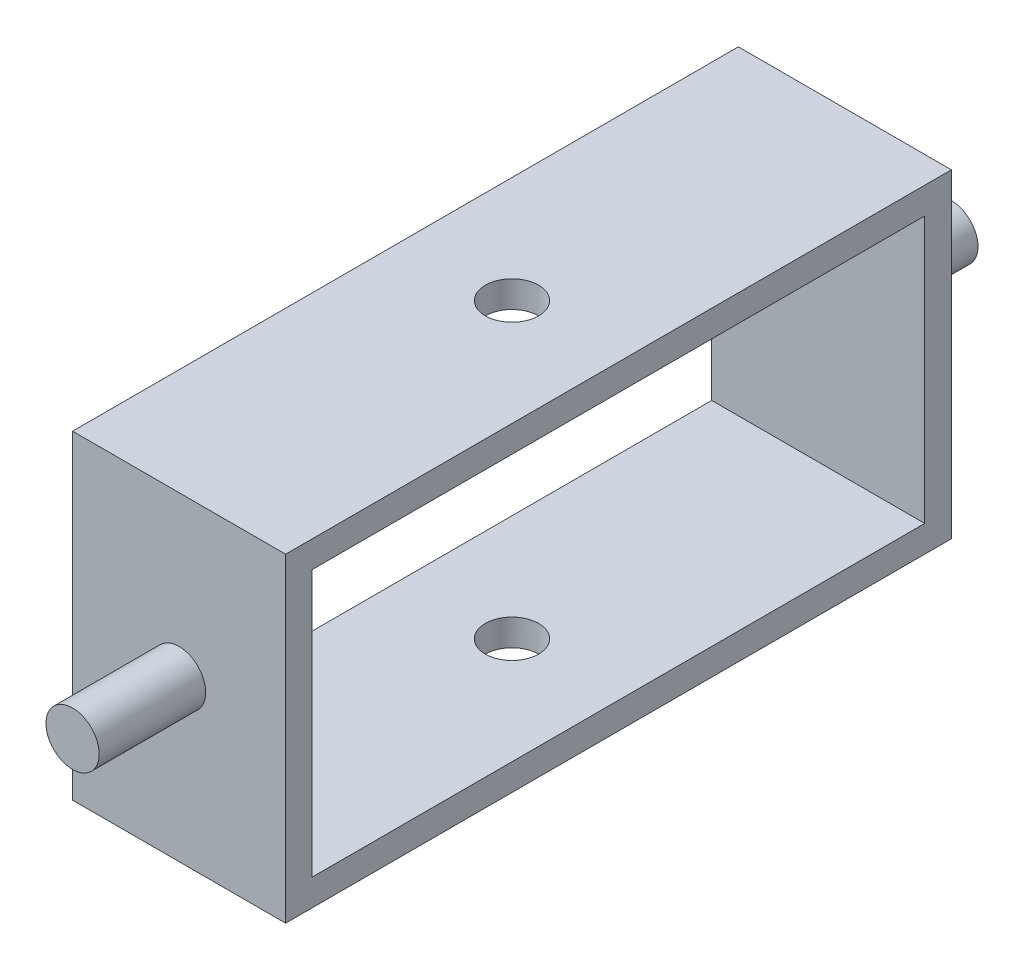
ISO-10303-21;
HEADER;
FILE_DESCRIPTION(('STEP AP214'),'2;1');
FILE_NAME('part.step','',(''),(''),'','','');
FILE_SCHEMA(('AUTOMOTIVE_DESIGN { 1 0 10303 214 1 1 1 1 }'));
ENDSEC;
DATA;
#1=APPLICATION_CONTEXT('core data for automotive mechanical design processes');
#2=APPLICATION_PROTOCOL_DEFINITION('international standard','automotive_design',2000,#1);
#3=PRODUCT_CONTEXT('',#1,'mechanical');
#4=PRODUCT('Part','Part','',(#3));
#5=PRODUCT_RELATED_PRODUCT_CATEGORY('part','',(#4));
#6=PRODUCT_DEFINITION_FORMATION('','',#4);
#7=PRODUCT_DEFINITION_CONTEXT('part definition',#1,'design');
#8=PRODUCT_DEFINITION('design','',#6,#7);
#9=PRODUCT_DEFINITION_SHAPE('','',#8);
#10=(LENGTH_UNIT() NAMED_UNIT(*) SI_UNIT(.MILLI.,.METRE.));
#11=(NAMED_UNIT(*) PLANE_ANGLE_UNIT() SI_UNIT($,.RADIAN.));
#12=(NAMED_UNIT(*) SI_UNIT($,.STERADIAN.) SOLID_ANGLE_UNIT());
#13=UNCERTAINTY_MEASURE_WITH_UNIT(LENGTH_MEASURE(1.E-05),#10,'distance_accuracy_value','');
#14=(GEOMETRIC_REPRESENTATION_CONTEXT(3) GLOBAL_UNCERTAINTY_ASSIGNED_CONTEXT((#13)) GLOBAL_UNIT_ASSIGNED_CONTEXT((#10,
#11,#12)) REPRESENTATION_CONTEXT('',''));
#15=CARTESIAN_POINT('',(0.,0.,0.));
#16=DIRECTION('',(0.,0.,1.));
#17=DIRECTION('',(1.,0.,0.));
#18=AXIS2_PLACEMENT_3D('',#15,#16,#17);
#19=CARTESIAN_POINT('',(0.,0.,25.));
#20=DIRECTION('',(0.,0.,1.));
#21=DIRECTION('',(1.,0.,0.));
#22=AXIS2_PLACEMENT_3D('',#19,#20,#21);
#23=PLANE('',#22);
#24=DIRECTION('',(0.,-1.,0.));
#25=VECTOR('',#24,1.);
#26=CARTESIAN_POINT('',(-20.,-30.,25.));
#27=LINE('',#26,#25);
#28=CARTESIAN_POINT('',(-20.,25.,25.));
#29=VERTEX_POINT('',#28);
#30=CARTESIAN_POINT('',(-20.,-25.,25.));
#31=VERTEX_POINT('',#30);
#32=EDGE_CURVE('E161',#29,#31,#27,.T.);
#33=ORIENTED_EDGE('',*,*,#32,.T.);
#34=DIRECTION('',(-1.,0.,0.));
#35=VECTOR('',#34,1.);
#36=CARTESIAN_POINT('',(-20.,-25.,25.));
#37=LINE('',#36,#35);
#38=CARTESIAN_POINT('',(20.,-25.,25.));
#39=VERTEX_POINT('',#38);
#40=EDGE_CURVE('E138',#39,#31,#37,.T.);
#41=ORIENTED_EDGE('',*,*,#40,.F.);
#42=DIRECTION('',(0.,1.,0.));
#43=VECTOR('',#42,1.);
#44=CARTESIAN_POINT('',(20.,-30.,25.));
#45=LINE('',#44,#43);
#46=CARTESIAN_POINT('',(20.,25.,25.));
#47=VERTEX_POINT('',#46);
#48=EDGE_CURVE('E171',#39,#47,#45,.T.);
#49=ORIENTED_EDGE('',*,*,#48,.T.);
#50=DIRECTION('',(1.,0.,0.));
#51=VECTOR('',#50,1.);
#52=CARTESIAN_POINT('',(-20.,25.,25.));
#53=LINE('',#52,#51);
#54=EDGE_CURVE('E59',#29,#47,#53,.T.);
#55=ORIENTED_EDGE('',*,*,#54,.F.);
#56=EDGE_LOOP('',(#33,#41,#49,#55));
#57=FACE_BOUND('',#56,.T.);
#58=ADVANCED_FACE('F34',(#57),#23,.T.);
#59=CARTESIAN_POINT('',(0.,0.,20.));
#60=DIRECTION('',(0.,0.,-1.));
#61=DIRECTION('',(-1.,0.,0.));
#62=AXIS2_PLACEMENT_3D('',#59,#60,#61);
#63=CYLINDRICAL_SURFACE('',#62,5.);
#64=CARTESIAN_POINT('',(0.,0.,20.));
#65=DIRECTION('',(0.,0.,1.));
#66=DIRECTION('',(1.,0.,0.));
#67=AXIS2_PLACEMENT_3D('',#64,#65,#66);
#68=CIRCLE('',#67,5.);
#69=CARTESIAN_POINT('',(5.,0.,20.));
#70=VERTEX_POINT('',#69);
#71=EDGE_CURVE('E11',#70,#70,#68,.T.);
#72=ORIENTED_EDGE('',*,*,#71,.F.);
#73=EDGE_LOOP('',(#72));
#74=FACE_BOUND('',#73,.T.);
#75=CARTESIAN_POINT('',(0.,0.,0.));
#76=DIRECTION('',(0.,0.,1.));
#77=DIRECTION('',(1.,0.,0.));
#78=AXIS2_PLACEMENT_3D('',#75,#76,#77);
#79=CIRCLE('',#78,5.);
#80=CARTESIAN_POINT('',(5.,0.,0.));
#81=VERTEX_POINT('',#80);
#82=EDGE_CURVE('E43',#81,#81,#79,.T.);
#83=ORIENTED_EDGE('',*,*,#82,.T.);
#84=EDGE_LOOP('',(#83));
#85=FACE_BOUND('',#84,.T.);
#86=ADVANCED_FACE('F36',(#74,#85),#63,.T.);
#87=CARTESIAN_POINT('',(0.,0.,0.));
#88=DIRECTION('',(0.,0.,1.));
#89=DIRECTION('',(1.,0.,0.));
#90=AXIS2_PLACEMENT_3D('',#87,#88,#89);
#91=PLANE('',#90);
#92=ORIENTED_EDGE('',*,*,#82,.F.);
#93=EDGE_LOOP('',(#92));
#94=FACE_BOUND('',#93,.T.);
#95=ADVANCED_FACE('F190',(#94),#91,.F.);
#96=CARTESIAN_POINT('',(-20.,-30.,25.));
#97=DIRECTION('',(1.,0.,0.));
#98=DIRECTION('',(0.,0.,-1.));
#99=AXIS2_PLACEMENT_3D('',#96,#97,#98);
#100=PLANE('',#99);
#101=DIRECTION('',(0.,0.,-1.));
#102=VECTOR('',#101,1.);
#103=CARTESIAN_POINT('',(-20.,25.,140.));
#104=LINE('',#103,#102);
#105=CARTESIAN_POINT('',(-20.,25.,140.));
#106=VERTEX_POINT('',#105);
#107=EDGE_CURVE('E165',#106,#29,#104,.T.);
#108=ORIENTED_EDGE('',*,*,#107,.F.);
#109=DIRECTION('',(0.,-1.,0.));
#110=VECTOR('',#109,1.);
#111=CARTESIAN_POINT('',(-20.,30.,140.));
#112=LINE('',#111,#110);
#113=CARTESIAN_POINT('',(-20.,-25.,140.));
#114=VERTEX_POINT('',#113);
#115=EDGE_CURVE('E130',#106,#114,#112,.T.);
#116=ORIENTED_EDGE('',*,*,#115,.T.);
#117=DIRECTION('',(0.,0.,-1.));
#118=VECTOR('',#117,1.);
#119=CARTESIAN_POINT('',(-20.,-25.,140.));
#120=LINE('',#119,#118);
#121=EDGE_CURVE('E145',#114,#31,#120,.T.);
#122=ORIENTED_EDGE('',*,*,#121,.T.);
#123=ORIENTED_EDGE('',*,*,#32,.F.);
#124=EDGE_LOOP('',(#108,#116,#122,#123));
#125=FACE_BOUND('',#124,.T.);
#126=DIRECTION('',(0.,-1.,0.));
#127=VECTOR('',#126,1.);
#128=CARTESIAN_POINT('',(-20.,-30.,20.));
#129=LINE('',#128,#127);
#130=CARTESIAN_POINT('',(-20.,30.,20.));
#131=VERTEX_POINT('',#130);
#132=CARTESIAN_POINT('',(-20.,-30.,20.));
#133=VERTEX_POINT('',#132);
#134=EDGE_CURVE('E110',#131,#133,#129,.T.);
#135=ORIENTED_EDGE('',*,*,#134,.T.);
#136=DIRECTION('',(0.,0.,-1.));
#137=VECTOR('',#136,1.);
#138=CARTESIAN_POINT('',(-20.,-30.,25.));
#139=LINE('',#138,#137);
#140=CARTESIAN_POINT('',(-20.,-30.,145.));
#141=VERTEX_POINT('',#140);
#142=EDGE_CURVE('E103',#141,#133,#139,.T.);
#143=ORIENTED_EDGE('',*,*,#142,.F.);
#144=DIRECTION('',(0.,-1.,0.));
#145=VECTOR('',#144,1.);
#146=CARTESIAN_POINT('',(-20.,30.,145.));
#147=LINE('',#146,#145);
#148=CARTESIAN_POINT('',(-20.,30.,145.));
#149=VERTEX_POINT('',#148);
#150=EDGE_CURVE('E108',#149,#141,#147,.T.);
#151=ORIENTED_EDGE('',*,*,#150,.F.);
#152=DIRECTION('',(0.,0.,-1.));
#153=VECTOR('',#152,1.);
#154=CARTESIAN_POINT('',(-20.,30.,25.));
#155=LINE('',#154,#153);
#156=EDGE_CURVE('E172',#149,#131,#155,.T.);
#157=ORIENTED_EDGE('',*,*,#156,.T.);
#158=EDGE_LOOP('',(#135,#143,#151,#157));
#159=FACE_BOUND('',#158,.T.);
#160=ADVANCED_FACE('F105',(#125,#159),#100,.F.);
#161=CARTESIAN_POINT('',(20.,-30.,25.));
#162=DIRECTION('',(0.,1.,0.));
#163=DIRECTION('',(-1.,0.,0.));
#164=AXIS2_PLACEMENT_3D('',#161,#162,#163);
#165=PLANE('',#164);
#166=CARTESIAN_POINT('',(0.,-30.,82.5));
#167=DIRECTION('',(0.,1.,0.));
#168=DIRECTION('',(-1.,0.,0.));
#169=AXIS2_PLACEMENT_3D('',#166,#167,#168);
#170=CIRCLE('',#169,5.);
#171=CARTESIAN_POINT('',(-5.,-30.,82.5));
#172=VERTEX_POINT('',#171);
#173=EDGE_CURVE('E225',#172,#172,#170,.T.);
#174=ORIENTED_EDGE('',*,*,#173,.T.);
#175=EDGE_LOOP('',(#174));
#176=FACE_BOUND('',#175,.T.);
#177=DIRECTION('',(1.,0.,0.));
#178=VECTOR('',#177,1.);
#179=CARTESIAN_POINT('',(20.,-30.,20.));
#180=LINE('',#179,#178);
#181=CARTESIAN_POINT('',(20.,-30.,20.));
#182=VERTEX_POINT('',#181);
#183=EDGE_CURVE('E176',#133,#182,#180,.T.);
#184=ORIENTED_EDGE('',*,*,#183,.T.);
#185=DIRECTION('',(0.,0.,-1.));
#186=VECTOR('',#185,1.);
#187=CARTESIAN_POINT('',(20.,-30.,25.));
#188=LINE('',#187,#186);
#189=CARTESIAN_POINT('',(20.,-30.,145.));
#190=VERTEX_POINT('',#189);
#191=EDGE_CURVE('E112',#190,#182,#188,.T.);
#192=ORIENTED_EDGE('',*,*,#191,.F.);
#193=DIRECTION('',(1.,0.,0.));
#194=VECTOR('',#193,1.);
#195=CARTESIAN_POINT('',(-20.,-30.,145.));
#196=LINE('',#195,#194);
#197=EDGE_CURVE('E115',#141,#190,#196,.T.);
#198=ORIENTED_EDGE('',*,*,#197,.F.);
#199=ORIENTED_EDGE('',*,*,#142,.T.);
#200=EDGE_LOOP('',(#184,#192,#198,#199));
#201=FACE_BOUND('',#200,.T.);
#202=ADVANCED_FACE('F116',(#176,#201),#165,.F.);
#203=CARTESIAN_POINT('',(20.,-30.,25.));
#204=DIRECTION('',(-1.,0.,0.));
#205=DIRECTION('',(0.,0.,1.));
#206=AXIS2_PLACEMENT_3D('',#203,#204,#205);
#207=PLANE('',#206);
#208=DIRECTION('',(0.,0.,-1.));
#209=VECTOR('',#208,1.);
#210=CARTESIAN_POINT('',(20.,30.,25.));
#211=LINE('',#210,#209);
#212=CARTESIAN_POINT('',(20.,30.,145.));
#213=VERTEX_POINT('',#212);
#214=CARTESIAN_POINT('',(20.,30.,20.));
#215=VERTEX_POINT('',#214);
#216=EDGE_CURVE('E183',#213,#215,#211,.T.);
#217=ORIENTED_EDGE('',*,*,#216,.F.);
#218=DIRECTION('',(0.,1.,0.));
#219=VECTOR('',#218,1.);
#220=CARTESIAN_POINT('',(20.,30.,145.));
#221=LINE('',#220,#219);
#222=EDGE_CURVE('E121',#190,#213,#221,.T.);
#223=ORIENTED_EDGE('',*,*,#222,.F.);
#224=ORIENTED_EDGE('',*,*,#191,.T.);
#225=DIRECTION('',(0.,1.,0.));
#226=VECTOR('',#225,1.);
#227=CARTESIAN_POINT('',(20.,-30.,20.));
#228=LINE('',#227,#226);
#229=EDGE_CURVE('E178',#182,#215,#228,.T.);
#230=ORIENTED_EDGE('',*,*,#229,.T.);
#231=EDGE_LOOP('',(#217,#223,#224,#230));
#232=FACE_BOUND('',#231,.T.);
#233=DIRECTION('',(0.,1.,0.));
#234=VECTOR('',#233,1.);
#235=CARTESIAN_POINT('',(20.,30.,140.));
#236=LINE('',#235,#234);
#237=CARTESIAN_POINT('',(20.,-25.,140.));
#238=VERTEX_POINT('',#237);
#239=CARTESIAN_POINT('',(20.,25.,140.));
#240=VERTEX_POINT('',#239);
#241=EDGE_CURVE('E127',#238,#240,#236,.T.);
#242=ORIENTED_EDGE('',*,*,#241,.T.);
#243=DIRECTION('',(0.,0.,-1.));
#244=VECTOR('',#243,1.);
#245=CARTESIAN_POINT('',(20.,25.,140.));
#246=LINE('',#245,#244);
#247=EDGE_CURVE('E153',#240,#47,#246,.T.);
#248=ORIENTED_EDGE('',*,*,#247,.T.);
#249=ORIENTED_EDGE('',*,*,#48,.F.);
#250=DIRECTION('',(0.,0.,-1.));
#251=VECTOR('',#250,1.);
#252=CARTESIAN_POINT('',(20.,-25.,140.));
#253=LINE('',#252,#251);
#254=EDGE_CURVE('E51',#238,#39,#253,.T.);
#255=ORIENTED_EDGE('',*,*,#254,.F.);
#256=EDGE_LOOP('',(#242,#248,#249,#255));
#257=FACE_BOUND('',#256,.T.);
#258=ADVANCED_FACE('F214',(#232,#257),#207,.F.);
#259=CARTESIAN_POINT('',(20.,30.,25.));
#260=DIRECTION('',(0.,-1.,0.));
#261=DIRECTION('',(0.,0.,-1.));
#262=AXIS2_PLACEMENT_3D('',#259,#260,#261);
#263=PLANE('',#262);
#264=CARTESIAN_POINT('',(0.,30.,82.5));
#265=DIRECTION('',(0.,1.,0.));
#266=DIRECTION('',(0.,0.,1.));
#267=AXIS2_PLACEMENT_3D('',#264,#265,#266);
#268=CIRCLE('',#267,5.);
#269=CARTESIAN_POINT('',(0.,30.,87.5));
#270=VERTEX_POINT('',#269);
#271=EDGE_CURVE('E269',#270,#270,#268,.T.);
#272=ORIENTED_EDGE('',*,*,#271,.F.);
#273=EDGE_LOOP('',(#272));
#274=FACE_BOUND('',#273,.T.);
#275=DIRECTION('',(-1.,0.,0.));
#276=VECTOR('',#275,1.);
#277=CARTESIAN_POINT('',(20.,30.,20.));
#278=LINE('',#277,#276);
#279=EDGE_CURVE('E180',#215,#131,#278,.T.);
#280=ORIENTED_EDGE('',*,*,#279,.T.);
#281=ORIENTED_EDGE('',*,*,#156,.F.);
#282=DIRECTION('',(-1.,0.,0.));
#283=VECTOR('',#282,1.);
#284=CARTESIAN_POINT('',(-20.,30.,145.));
#285=LINE('',#284,#283);
#286=EDGE_CURVE('E126',#213,#149,#285,.T.);
#287=ORIENTED_EDGE('',*,*,#286,.F.);
#288=ORIENTED_EDGE('',*,*,#216,.T.);
#289=EDGE_LOOP('',(#280,#281,#287,#288));
#290=FACE_BOUND('',#289,.T.);
#291=ADVANCED_FACE('F210',(#274,#290),#263,.F.);
#292=CARTESIAN_POINT('',(0.,0.,20.));
#293=DIRECTION('',(0.,0.,1.));
#294=DIRECTION('',(1.,0.,0.));
#295=AXIS2_PLACEMENT_3D('',#292,#293,#294);
#296=PLANE('',#295);
#297=ORIENTED_EDGE('',*,*,#71,.T.);
#298=EDGE_LOOP('',(#297));
#299=FACE_BOUND('',#298,.T.);
#300=ORIENTED_EDGE('',*,*,#134,.F.);
#301=ORIENTED_EDGE('',*,*,#279,.F.);
#302=ORIENTED_EDGE('',*,*,#229,.F.);
#303=ORIENTED_EDGE('',*,*,#183,.F.);
#304=EDGE_LOOP('',(#300,#301,#302,#303));
#305=FACE_BOUND('',#304,.T.);
#306=ADVANCED_FACE('F207',(#299,#305),#296,.F.);
#307=CARTESIAN_POINT('',(-20.,25.,140.));
#308=DIRECTION('',(0.,1.,0.));
#309=DIRECTION('',(0.,0.,1.));
#310=AXIS2_PLACEMENT_3D('',#307,#308,#309);
#311=PLANE('',#310);
#312=CARTESIAN_POINT('',(0.,25.,82.5));
#313=DIRECTION('',(0.,1.,0.));
#314=DIRECTION('',(0.,0.,1.));
#315=AXIS2_PLACEMENT_3D('',#312,#313,#314);
#316=CIRCLE('',#315,5.);
#317=CARTESIAN_POINT('',(0.,25.,87.5));
#318=VERTEX_POINT('',#317);
#319=EDGE_CURVE('E227',#318,#318,#316,.T.);
#320=ORIENTED_EDGE('',*,*,#319,.T.);
#321=EDGE_LOOP('',(#320));
#322=FACE_BOUND('',#321,.T.);
#323=ORIENTED_EDGE('',*,*,#54,.T.);
#324=ORIENTED_EDGE('',*,*,#247,.F.);
#325=DIRECTION('',(1.,0.,0.));
#326=VECTOR('',#325,1.);
#327=CARTESIAN_POINT('',(-20.,25.,140.));
#328=LINE('',#327,#326);
#329=EDGE_CURVE('E150',#106,#240,#328,.T.);
#330=ORIENTED_EDGE('',*,*,#329,.F.);
#331=ORIENTED_EDGE('',*,*,#107,.T.);
#332=EDGE_LOOP('',(#323,#324,#330,#331));
#333=FACE_BOUND('',#332,.T.);
#334=ADVANCED_FACE('F205',(#322,#333),#311,.F.);
#335=CARTESIAN_POINT('',(-20.,-25.,140.));
#336=DIRECTION('',(0.,-1.,0.));
#337=DIRECTION('',(0.,0.,-1.));
#338=AXIS2_PLACEMENT_3D('',#335,#336,#337);
#339=PLANE('',#338);
#340=CARTESIAN_POINT('',(0.,-25.,82.5));
#341=DIRECTION('',(0.,-1.,0.));
#342=DIRECTION('',(0.,0.,-1.));
#343=AXIS2_PLACEMENT_3D('',#340,#341,#342);
#344=CIRCLE('',#343,5.);
#345=CARTESIAN_POINT('',(0.,-25.,77.5));
#346=VERTEX_POINT('',#345);
#347=EDGE_CURVE('E38',#346,#346,#344,.T.);
#348=ORIENTED_EDGE('',*,*,#347,.T.);
#349=EDGE_LOOP('',(#348));
#350=FACE_BOUND('',#349,.T.);
#351=ORIENTED_EDGE('',*,*,#40,.T.);
#352=ORIENTED_EDGE('',*,*,#121,.F.);
#353=DIRECTION('',(-1.,0.,0.));
#354=VECTOR('',#353,1.);
#355=CARTESIAN_POINT('',(-20.,-25.,140.));
#356=LINE('',#355,#354);
#357=EDGE_CURVE('E142',#238,#114,#356,.T.);
#358=ORIENTED_EDGE('',*,*,#357,.F.);
#359=ORIENTED_EDGE('',*,*,#254,.T.);
#360=EDGE_LOOP('',(#351,#352,#358,#359));
#361=FACE_BOUND('',#360,.T.);
#362=ADVANCED_FACE('F250',(#350,#361),#339,.F.);
#363=CARTESIAN_POINT('',(0.,0.,140.));
#364=DIRECTION('',(0.,0.,1.));
#365=DIRECTION('',(1.,0.,0.));
#366=AXIS2_PLACEMENT_3D('',#363,#364,#365);
#367=PLANE('',#366);
#368=ORIENTED_EDGE('',*,*,#115,.F.);
#369=ORIENTED_EDGE('',*,*,#329,.T.);
#370=ORIENTED_EDGE('',*,*,#241,.F.);
#371=ORIENTED_EDGE('',*,*,#357,.T.);
#372=EDGE_LOOP('',(#368,#369,#370,#371));
#373=FACE_BOUND('',#372,.T.);
#374=ADVANCED_FACE('F245',(#373),#367,.F.);
#375=CARTESIAN_POINT('',(0.,0.,145.));
#376=DIRECTION('',(0.,0.,1.));
#377=DIRECTION('',(1.,0.,0.));
#378=AXIS2_PLACEMENT_3D('',#375,#376,#377);
#379=PLANE('',#378);
#380=CARTESIAN_POINT('',(0.,0.,145.));
#381=DIRECTION('',(0.,0.,1.));
#382=DIRECTION('',(1.,0.,0.));
#383=AXIS2_PLACEMENT_3D('',#380,#381,#382);
#384=CIRCLE('',#383,5.);
#385=CARTESIAN_POINT('',(5.,0.,145.));
#386=VERTEX_POINT('',#385);
#387=EDGE_CURVE('E133',#386,#386,#384,.T.);
#388=ORIENTED_EDGE('',*,*,#387,.F.);
#389=EDGE_LOOP('',(#388));
#390=FACE_BOUND('',#389,.T.);
#391=ORIENTED_EDGE('',*,*,#150,.T.);
#392=ORIENTED_EDGE('',*,*,#197,.T.);
#393=ORIENTED_EDGE('',*,*,#222,.T.);
#394=ORIENTED_EDGE('',*,*,#286,.T.);
#395=EDGE_LOOP('',(#391,#392,#393,#394));
#396=FACE_BOUND('',#395,.T.);
#397=ADVANCED_FACE('F124',(#390,#396),#379,.T.);
#398=CARTESIAN_POINT('',(0.,0.,165.));
#399=DIRECTION('',(0.,0.,-1.));
#400=DIRECTION('',(-1.,0.,0.));
#401=AXIS2_PLACEMENT_3D('',#398,#399,#400);
#402=CYLINDRICAL_SURFACE('',#401,5.);
#403=CARTESIAN_POINT('',(0.,0.,165.));
#404=DIRECTION('',(0.,0.,1.));
#405=DIRECTION('',(1.,0.,0.));
#406=AXIS2_PLACEMENT_3D('',#403,#404,#405);
#407=CIRCLE('',#406,5.);
#408=CARTESIAN_POINT('',(5.,0.,165.));
#409=VERTEX_POINT('',#408);
#410=EDGE_CURVE('E140',#409,#409,#407,.T.);
#411=ORIENTED_EDGE('',*,*,#410,.F.);
#412=EDGE_LOOP('',(#411));
#413=FACE_BOUND('',#412,.T.);
#414=ORIENTED_EDGE('',*,*,#387,.T.);
#415=EDGE_LOOP('',(#414));
#416=FACE_BOUND('',#415,.T.);
#417=ADVANCED_FACE('F238',(#413,#416),#402,.T.);
#418=CARTESIAN_POINT('',(0.,0.,165.));
#419=DIRECTION('',(0.,0.,1.));
#420=DIRECTION('',(1.,0.,0.));
#421=AXIS2_PLACEMENT_3D('',#418,#419,#420);
#422=PLANE('',#421);
#423=ORIENTED_EDGE('',*,*,#410,.T.);
#424=EDGE_LOOP('',(#423));
#425=FACE_BOUND('',#424,.T.);
#426=ADVANCED_FACE('F236',(#425),#422,.T.);
#427=CARTESIAN_POINT('',(0.,-211.,82.5));
#428=DIRECTION('',(0.,1.,0.));
#429=DIRECTION('',(0.,0.,1.));
#430=AXIS2_PLACEMENT_3D('',#427,#428,#429);
#431=CYLINDRICAL_SURFACE('',#430,5.);
#432=ORIENTED_EDGE('',*,*,#347,.F.);
#433=EDGE_LOOP('',(#432));
#434=FACE_BOUND('',#433,.T.);
#435=ORIENTED_EDGE('',*,*,#173,.F.);
#436=EDGE_LOOP('',(#435));
#437=FACE_BOUND('',#436,.T.);
#438=ADVANCED_FACE('F280',(#434,#437),#431,.F.);
#439=ORIENTED_EDGE('',*,*,#271,.T.);
#440=EDGE_LOOP('',(#439));
#441=FACE_BOUND('',#440,.T.);
#442=ORIENTED_EDGE('',*,*,#319,.F.);
#443=EDGE_LOOP('',(#442));
#444=FACE_BOUND('',#443,.T.);
#445=ADVANCED_FACE('F273',(#441,#444),#431,.F.);
#446=CLOSED_SHELL('',(#58,#86,#95,#160,#202,#258,#291,#306,#334,#362,#374,#397,#417,#426,#438,#445));
#447=MANIFOLD_SOLID_BREP('B2',#446);
#448=ADVANCED_BREP_SHAPE_REPRESENTATION('',(#18,#447),#14);
#449=SHAPE_DEFINITION_REPRESENTATION(#9,#448);
ENDSEC;
END-ISO-10303-21;
